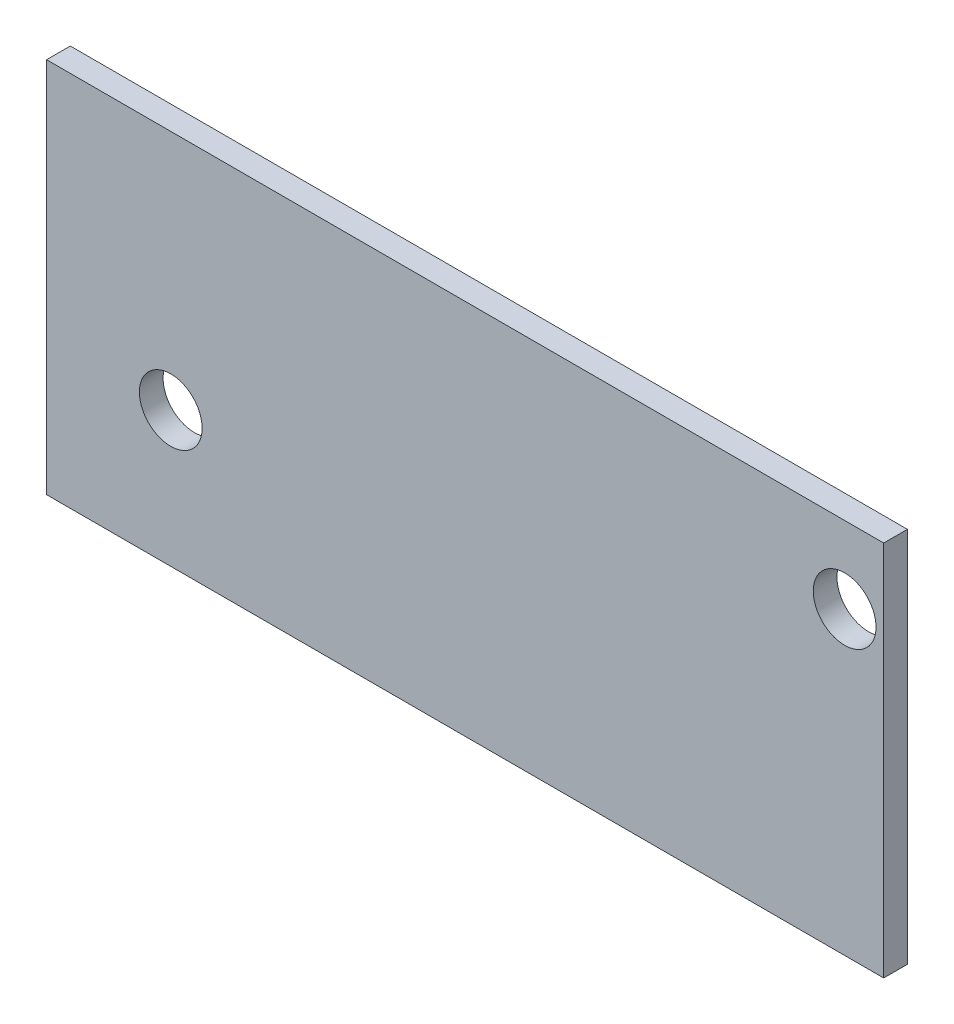
ISO-10303-21;
HEADER;
FILE_DESCRIPTION(('STEP AP214'),'2;1');
FILE_NAME('part.step','',(''),(''),'','','');
FILE_SCHEMA(('AUTOMOTIVE_DESIGN { 1 0 10303 214 1 1 1 1 }'));
ENDSEC;
DATA;
#1=APPLICATION_CONTEXT('core data for automotive mechanical design processes');
#2=APPLICATION_PROTOCOL_DEFINITION('international standard','automotive_design',2000,#1);
#3=PRODUCT_CONTEXT('',#1,'mechanical');
#4=PRODUCT('Part','Part','',(#3));
#5=PRODUCT_RELATED_PRODUCT_CATEGORY('part','',(#4));
#6=PRODUCT_DEFINITION_FORMATION('','',#4);
#7=PRODUCT_DEFINITION_CONTEXT('part definition',#1,'design');
#8=PRODUCT_DEFINITION('design','',#6,#7);
#9=PRODUCT_DEFINITION_SHAPE('','',#8);
#10=(LENGTH_UNIT() NAMED_UNIT(*) SI_UNIT(.MILLI.,.METRE.));
#11=(NAMED_UNIT(*) PLANE_ANGLE_UNIT() SI_UNIT($,.RADIAN.));
#12=(NAMED_UNIT(*) SI_UNIT($,.STERADIAN.) SOLID_ANGLE_UNIT());
#13=UNCERTAINTY_MEASURE_WITH_UNIT(LENGTH_MEASURE(1.E-05),#10,'distance_accuracy_value','');
#14=(GEOMETRIC_REPRESENTATION_CONTEXT(3) GLOBAL_UNCERTAINTY_ASSIGNED_CONTEXT((#13)) GLOBAL_UNIT_ASSIGNED_CONTEXT((#10,
#11,#12)) REPRESENTATION_CONTEXT('',''));
#15=CARTESIAN_POINT('',(0.,0.,0.));
#16=DIRECTION('',(0.,0.,1.));
#17=DIRECTION('',(1.,0.,0.));
#18=AXIS2_PLACEMENT_3D('',#15,#16,#17);
#19=CARTESIAN_POINT('',(-2.19895287958116,29.7015706806283,1.7));
#20=DIRECTION('',(1.,0.,0.));
#21=DIRECTION('',(0.,0.,-1.));
#22=AXIS2_PLACEMENT_3D('',#19,#20,#21);
#23=PLANE('',#22);
#24=DIRECTION('',(0.,-1.,0.));
#25=VECTOR('',#24,1.);
#26=CARTESIAN_POINT('',(-2.19895287958116,29.7015706806283,0.));
#27=LINE('',#26,#25);
#28=CARTESIAN_POINT('',(-2.19895287958116,56.7015706806283,0.));
#29=VERTEX_POINT('',#28);
#30=CARTESIAN_POINT('',(-2.19895287958116,29.7015706806283,0.));
#31=VERTEX_POINT('',#30);
#32=EDGE_CURVE('E99',#29,#31,#27,.T.);
#33=ORIENTED_EDGE('',*,*,#32,.T.);
#34=DIRECTION('',(0.,0.,-1.));
#35=VECTOR('',#34,1.);
#36=CARTESIAN_POINT('',(-2.19895287958116,29.7015706806283,1.7));
#37=LINE('',#36,#35);
#38=CARTESIAN_POINT('',(-2.19895287958116,29.7015706806283,1.7));
#39=VERTEX_POINT('',#38);
#40=EDGE_CURVE('E11',#39,#31,#37,.T.);
#41=ORIENTED_EDGE('',*,*,#40,.F.);
#42=DIRECTION('',(0.,-1.,0.));
#43=VECTOR('',#42,1.);
#44=CARTESIAN_POINT('',(-2.19895287958116,29.7015706806283,1.7));
#45=LINE('',#44,#43);
#46=CARTESIAN_POINT('',(-2.19895287958116,56.7015706806283,1.7));
#47=VERTEX_POINT('',#46);
#48=EDGE_CURVE('E87',#47,#39,#45,.T.);
#49=ORIENTED_EDGE('',*,*,#48,.F.);
#50=DIRECTION('',(0.,0.,-1.));
#51=VECTOR('',#50,1.);
#52=CARTESIAN_POINT('',(-2.19895287958116,56.7015706806283,1.7));
#53=LINE('',#52,#51);
#54=EDGE_CURVE('E95',#47,#29,#53,.T.);
#55=ORIENTED_EDGE('',*,*,#54,.T.);
#56=EDGE_LOOP('',(#33,#41,#49,#55));
#57=FACE_BOUND('',#56,.T.);
#58=ADVANCED_FACE('F36',(#57),#23,.F.);
#59=CARTESIAN_POINT('',(-2.19895287958116,29.7015706806283,1.7));
#60=DIRECTION('',(0.,1.,0.));
#61=DIRECTION('',(0.,0.,1.));
#62=AXIS2_PLACEMENT_3D('',#59,#60,#61);
#63=PLANE('',#62);
#64=DIRECTION('',(1.,0.,0.));
#65=VECTOR('',#64,1.);
#66=CARTESIAN_POINT('',(-2.19895287958116,29.7015706806283,0.));
#67=LINE('',#66,#65);
#68=CARTESIAN_POINT('',(57.8010471204188,29.7015706806283,0.));
#69=VERTEX_POINT('',#68);
#70=EDGE_CURVE('E91',#31,#69,#67,.T.);
#71=ORIENTED_EDGE('',*,*,#70,.T.);
#72=DIRECTION('',(0.,0.,-1.));
#73=VECTOR('',#72,1.);
#74=CARTESIAN_POINT('',(57.8010471204188,29.7015706806283,1.7));
#75=LINE('',#74,#73);
#76=CARTESIAN_POINT('',(57.8010471204188,29.7015706806283,1.7));
#77=VERTEX_POINT('',#76);
#78=EDGE_CURVE('E44',#77,#69,#75,.T.);
#79=ORIENTED_EDGE('',*,*,#78,.F.);
#80=DIRECTION('',(1.,0.,0.));
#81=VECTOR('',#80,1.);
#82=CARTESIAN_POINT('',(-2.19895287958116,29.7015706806283,1.7));
#83=LINE('',#82,#81);
#84=EDGE_CURVE('E82',#39,#77,#83,.T.);
#85=ORIENTED_EDGE('',*,*,#84,.F.);
#86=ORIENTED_EDGE('',*,*,#40,.T.);
#87=EDGE_LOOP('',(#71,#79,#85,#86));
#88=FACE_BOUND('',#87,.T.);
#89=ADVANCED_FACE('F90',(#88),#63,.F.);
#90=CARTESIAN_POINT('',(57.8010471204188,29.7015706806283,1.7));
#91=DIRECTION('',(-1.,0.,0.));
#92=DIRECTION('',(0.,-1.,0.));
#93=AXIS2_PLACEMENT_3D('',#90,#91,#92);
#94=PLANE('',#93);
#95=DIRECTION('',(0.,1.,0.));
#96=VECTOR('',#95,1.);
#97=CARTESIAN_POINT('',(57.8010471204188,29.7015706806283,0.));
#98=LINE('',#97,#96);
#99=CARTESIAN_POINT('',(57.8010471204188,56.7015706806283,0.));
#100=VERTEX_POINT('',#99);
#101=EDGE_CURVE('E69',#69,#100,#98,.T.);
#102=ORIENTED_EDGE('',*,*,#101,.T.);
#103=DIRECTION('',(0.,0.,-1.));
#104=VECTOR('',#103,1.);
#105=CARTESIAN_POINT('',(57.8010471204188,56.7015706806283,1.7));
#106=LINE('',#105,#104);
#107=CARTESIAN_POINT('',(57.8010471204188,56.7015706806283,1.7));
#108=VERTEX_POINT('',#107);
#109=EDGE_CURVE('E92',#108,#100,#106,.T.);
#110=ORIENTED_EDGE('',*,*,#109,.F.);
#111=DIRECTION('',(0.,1.,0.));
#112=VECTOR('',#111,1.);
#113=CARTESIAN_POINT('',(57.8010471204188,29.7015706806283,1.7));
#114=LINE('',#113,#112);
#115=EDGE_CURVE('E85',#77,#108,#114,.T.);
#116=ORIENTED_EDGE('',*,*,#115,.F.);
#117=ORIENTED_EDGE('',*,*,#78,.T.);
#118=EDGE_LOOP('',(#102,#110,#116,#117));
#119=FACE_BOUND('',#118,.T.);
#120=ADVANCED_FACE('F93',(#119),#94,.F.);
#121=CARTESIAN_POINT('',(-2.19895287958116,56.7015706806283,1.7));
#122=DIRECTION('',(0.,-1.,0.));
#123=DIRECTION('',(0.,0.,-1.));
#124=AXIS2_PLACEMENT_3D('',#121,#122,#123);
#125=PLANE('',#124);
#126=DIRECTION('',(-1.,0.,0.));
#127=VECTOR('',#126,1.);
#128=CARTESIAN_POINT('',(-2.19895287958116,56.7015706806283,0.));
#129=LINE('',#128,#127);
#130=EDGE_CURVE('E75',#100,#29,#129,.T.);
#131=ORIENTED_EDGE('',*,*,#130,.T.);
#132=ORIENTED_EDGE('',*,*,#54,.F.);
#133=DIRECTION('',(-1.,0.,0.));
#134=VECTOR('',#133,1.);
#135=CARTESIAN_POINT('',(-2.19895287958116,56.7015706806283,1.7));
#136=LINE('',#135,#134);
#137=EDGE_CURVE('E52',#108,#47,#136,.T.);
#138=ORIENTED_EDGE('',*,*,#137,.F.);
#139=ORIENTED_EDGE('',*,*,#109,.T.);
#140=EDGE_LOOP('',(#131,#132,#138,#139));
#141=FACE_BOUND('',#140,.T.);
#142=ADVANCED_FACE('F107',(#141),#125,.F.);
#143=CARTESIAN_POINT('',(0.,0.,1.7));
#144=DIRECTION('',(0.,0.,-1.));
#145=DIRECTION('',(-1.,0.,0.));
#146=AXIS2_PLACEMENT_3D('',#143,#144,#145);
#147=PLANE('',#146);
#148=CARTESIAN_POINT('',(6.70155649541888,39.4022319306283,1.7));
#149=DIRECTION('',(0.,0.,-1.));
#150=DIRECTION('',(-1.,0.,0.));
#151=AXIS2_PLACEMENT_3D('',#148,#149,#150);
#152=CIRCLE('',#151,2.25);
#153=CARTESIAN_POINT('',(4.45155649541888,39.4022319306283,1.7));
#154=VERTEX_POINT('',#153);
#155=EDGE_CURVE('E118',#154,#154,#152,.T.);
#156=ORIENTED_EDGE('',*,*,#155,.T.);
#157=EDGE_LOOP('',(#156));
#158=FACE_BOUND('',#157,.T.);
#159=CARTESIAN_POINT('',(55.0015564954189,51.2022319306283,1.7));
#160=DIRECTION('',(0.,0.,-1.));
#161=DIRECTION('',(-1.,0.,0.));
#162=AXIS2_PLACEMENT_3D('',#159,#160,#161);
#163=CIRCLE('',#162,2.25);
#164=CARTESIAN_POINT('',(52.7515564954189,51.2022319306283,1.7));
#165=VERTEX_POINT('',#164);
#166=EDGE_CURVE('E102',#165,#165,#163,.T.);
#167=ORIENTED_EDGE('',*,*,#166,.T.);
#168=EDGE_LOOP('',(#167));
#169=FACE_BOUND('',#168,.T.);
#170=ORIENTED_EDGE('',*,*,#48,.T.);
#171=ORIENTED_EDGE('',*,*,#84,.T.);
#172=ORIENTED_EDGE('',*,*,#115,.T.);
#173=ORIENTED_EDGE('',*,*,#137,.T.);
#174=EDGE_LOOP('',(#170,#171,#172,#173));
#175=FACE_BOUND('',#174,.T.);
#176=ADVANCED_FACE('F83',(#158,#169,#175),#147,.F.);
#177=CARTESIAN_POINT('',(0.,0.,0.));
#178=DIRECTION('',(0.,0.,-1.));
#179=DIRECTION('',(-1.,0.,0.));
#180=AXIS2_PLACEMENT_3D('',#177,#178,#179);
#181=PLANE('',#180);
#182=CARTESIAN_POINT('',(6.70155649541888,39.4022319306283,0.));
#183=DIRECTION('',(0.,0.,-1.));
#184=DIRECTION('',(-1.,0.,0.));
#185=AXIS2_PLACEMENT_3D('',#182,#183,#184);
#186=CIRCLE('',#185,2.25);
#187=CARTESIAN_POINT('',(4.45155649541888,39.4022319306283,0.));
#188=VERTEX_POINT('',#187);
#189=EDGE_CURVE('E121',#188,#188,#186,.T.);
#190=ORIENTED_EDGE('',*,*,#189,.F.);
#191=EDGE_LOOP('',(#190));
#192=FACE_BOUND('',#191,.T.);
#193=CARTESIAN_POINT('',(55.0015564954189,51.2022319306283,0.));
#194=DIRECTION('',(0.,0.,-1.));
#195=DIRECTION('',(-1.,0.,0.));
#196=AXIS2_PLACEMENT_3D('',#193,#194,#195);
#197=CIRCLE('',#196,2.25);
#198=CARTESIAN_POINT('',(52.7515564954189,51.2022319306283,0.));
#199=VERTEX_POINT('',#198);
#200=EDGE_CURVE('E115',#199,#199,#197,.T.);
#201=ORIENTED_EDGE('',*,*,#200,.F.);
#202=EDGE_LOOP('',(#201));
#203=FACE_BOUND('',#202,.T.);
#204=ORIENTED_EDGE('',*,*,#32,.F.);
#205=ORIENTED_EDGE('',*,*,#130,.F.);
#206=ORIENTED_EDGE('',*,*,#101,.F.);
#207=ORIENTED_EDGE('',*,*,#70,.F.);
#208=EDGE_LOOP('',(#204,#205,#206,#207));
#209=FACE_BOUND('',#208,.T.);
#210=ADVANCED_FACE('F110',(#192,#203,#209),#181,.T.);
#211=CARTESIAN_POINT('',(55.0015564954189,51.2022319306283,10.));
#212=DIRECTION('',(0.,0.,-1.));
#213=DIRECTION('',(-1.,0.,0.));
#214=AXIS2_PLACEMENT_3D('',#211,#212,#213);
#215=CYLINDRICAL_SURFACE('',#214,2.25);
#216=ORIENTED_EDGE('',*,*,#200,.T.);
#217=EDGE_LOOP('',(#216));
#218=FACE_BOUND('',#217,.T.);
#219=ORIENTED_EDGE('',*,*,#166,.F.);
#220=EDGE_LOOP('',(#219));
#221=FACE_BOUND('',#220,.T.);
#222=ADVANCED_FACE('F130',(#218,#221),#215,.F.);
#223=CARTESIAN_POINT('',(6.70155649541888,39.4022319306283,10.));
#224=DIRECTION('',(0.,0.,-1.));
#225=DIRECTION('',(-1.,0.,0.));
#226=AXIS2_PLACEMENT_3D('',#223,#224,#225);
#227=CYLINDRICAL_SURFACE('',#226,2.25);
#228=ORIENTED_EDGE('',*,*,#189,.T.);
#229=EDGE_LOOP('',(#228));
#230=FACE_BOUND('',#229,.T.);
#231=ORIENTED_EDGE('',*,*,#155,.F.);
#232=EDGE_LOOP('',(#231));
#233=FACE_BOUND('',#232,.T.);
#234=ADVANCED_FACE('F125',(#230,#233),#227,.F.);
#235=CLOSED_SHELL('',(#58,#89,#120,#142,#176,#210,#222,#234));
#236=MANIFOLD_SOLID_BREP('B2',#235);
#237=ADVANCED_BREP_SHAPE_REPRESENTATION('',(#18,#236),#14);
#238=SHAPE_DEFINITION_REPRESENTATION(#9,#237);
ENDSEC;
END-ISO-10303-21;
